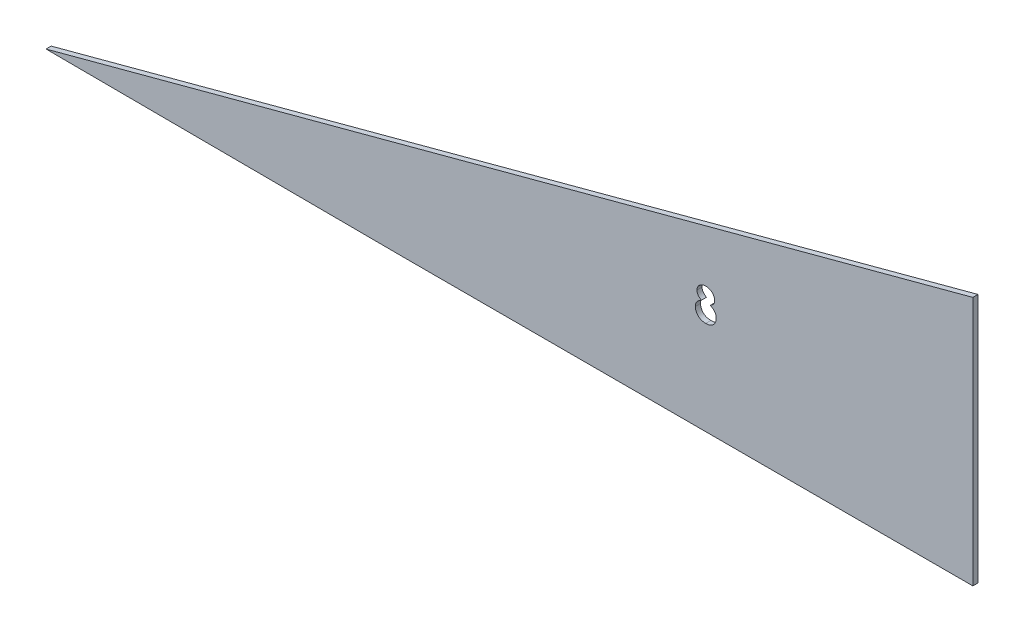
ISO-10303-21;
HEADER;
FILE_DESCRIPTION(('STEP AP214'),'2;1');
FILE_NAME('part.step','',(''),(''),'','','');
FILE_SCHEMA(('AUTOMOTIVE_DESIGN { 1 0 10303 214 1 1 1 1 }'));
ENDSEC;
DATA;
#1=APPLICATION_CONTEXT('core data for automotive mechanical design processes');
#2=APPLICATION_PROTOCOL_DEFINITION('international standard','automotive_design',2000,#1);
#3=PRODUCT_CONTEXT('',#1,'mechanical');
#4=PRODUCT('Part','Part','',(#3));
#5=PRODUCT_RELATED_PRODUCT_CATEGORY('part','',(#4));
#6=PRODUCT_DEFINITION_FORMATION('','',#4);
#7=PRODUCT_DEFINITION_CONTEXT('part definition',#1,'design');
#8=PRODUCT_DEFINITION('design','',#6,#7);
#9=PRODUCT_DEFINITION_SHAPE('','',#8);
#10=(LENGTH_UNIT() NAMED_UNIT(*) SI_UNIT(.MILLI.,.METRE.));
#11=(NAMED_UNIT(*) PLANE_ANGLE_UNIT() SI_UNIT($,.RADIAN.));
#12=(NAMED_UNIT(*) SI_UNIT($,.STERADIAN.) SOLID_ANGLE_UNIT());
#13=UNCERTAINTY_MEASURE_WITH_UNIT(LENGTH_MEASURE(1.E-05),#10,'distance_accuracy_value','');
#14=(GEOMETRIC_REPRESENTATION_CONTEXT(3) GLOBAL_UNCERTAINTY_ASSIGNED_CONTEXT((#13)) GLOBAL_UNIT_ASSIGNED_CONTEXT((#10,
#11,#12)) REPRESENTATION_CONTEXT('',''));
#15=CARTESIAN_POINT('',(0.,0.,0.));
#16=DIRECTION('',(0.,0.,1.));
#17=DIRECTION('',(1.,0.,0.));
#18=AXIS2_PLACEMENT_3D('',#15,#16,#17);
#19=CARTESIAN_POINT('',(0.,0.,-2105.025));
#20=DIRECTION('',(0.,0.,-1.));
#21=DIRECTION('',(1.,0.,0.));
#22=AXIS2_PLACEMENT_3D('',#19,#20,#21);
#23=PLANE('',#22);
#24=CARTESIAN_POINT('',(-108.484035099965,272.503264575399,-2105.025));
#25=CARTESIAN_POINT('',(-108.241807192656,272.495392336472,-2105.025));
#26=CARTESIAN_POINT('',(-107.764161354784,272.479869178137,-2105.025));
#27=CARTESIAN_POINT('',(-107.062062024677,272.350400598971,-2105.025));
#28=CARTESIAN_POINT('',(-106.390278048918,272.134158498639,-2105.025));
#29=CARTESIAN_POINT('',(-105.751126061882,271.840803611661,-2105.025));
#30=CARTESIAN_POINT('',(-105.156048326082,271.479468976697,-2105.025));
#31=CARTESIAN_POINT('',(-104.630255757144,271.041858504966,-2105.025));
#32=CARTESIAN_POINT('',(-104.165802703875,270.551230921757,-2105.025));
#33=CARTESIAN_POINT('',(-103.781621929411,270.001939938007,-2105.025));
#34=CARTESIAN_POINT('',(-103.465049631291,269.421273112649,-2105.025));
#35=CARTESIAN_POINT('',(-103.244609012356,268.813727677503,-2105.025));
#36=CARTESIAN_POINT('',(-103.103356125449,268.192430657128,-2105.025));
#37=CARTESIAN_POINT('',(-103.085539671892,267.772035235866,-2105.025));
#38=CARTESIAN_POINT('',(-103.076613224965,267.561407604245,-2105.025));
#39=B_SPLINE_CURVE_WITH_KNOTS('',3,(#24,#25,#26,#27,#28,#29,#30,#31,#32,#33,#34,#35,#36,#37,
#38),.UNSPECIFIED.,.F.,.F.,(4,1,1,1,1,1,1,1,1,1,1,1,4),(0.,0.0894097111101345,0.176305764483106,
0.262625902183418,0.349445726475656,0.435498263742955,0.518928130103714,0.601354656578741,
0.684256421718418,0.765806739796834,0.844876865710391,0.922279794848877,1.),.UNSPECIFIED.);
#40=CARTESIAN_POINT('',(-108.484035099965,272.503264575399,-2105.025));
#41=VERTEX_POINT('',#40);
#42=CARTESIAN_POINT('',(-103.076613224965,267.561407604245,-2105.025));
#43=VERTEX_POINT('',#42);
#44=EDGE_CURVE('E178',#41,#43,#39,.T.);
#45=ORIENTED_EDGE('',*,*,#44,.F.);
#46=CARTESIAN_POINT('',(-114.066997840349,267.614833085014,-2105.025));
#47=CARTESIAN_POINT('',(-114.058096460617,267.817838367063,-2105.025));
#48=CARTESIAN_POINT('',(-114.040203134988,268.225914387328,-2105.025));
#49=CARTESIAN_POINT('',(-113.89551391866,268.83337057283,-2105.025));
#50=CARTESIAN_POINT('',(-113.65972898521,269.429997876748,-2105.025));
#51=CARTESIAN_POINT('',(-113.339030415753,270.012904542242,-2105.025));
#52=CARTESIAN_POINT('',(-112.939594282156,270.562362139189,-2105.025));
#53=CARTESIAN_POINT('',(-112.460369511276,271.055163575398,-2105.025));
#54=CARTESIAN_POINT('',(-111.912800138581,271.486844644352,-2105.025));
#55=CARTESIAN_POINT('',(-111.299619462462,271.84920924174,-2105.025));
#56=CARTESIAN_POINT('',(-110.639747950826,272.144123155998,-2105.025));
#57=CARTESIAN_POINT('',(-109.943520939403,272.347568571625,-2105.025));
#58=CARTESIAN_POINT('',(-109.223069026641,272.48057086399,-2105.025));
#59=CARTESIAN_POINT('',(-108.73268001133,272.495629369953,-2105.025));
#60=CARTESIAN_POINT('',(-108.484035099965,272.503264575399,-2105.025));
#61=B_SPLINE_CURVE_WITH_KNOTS('',3,(#46,#47,#48,#49,#50,#51,#52,#53,#54,#55,#56,#57,#58,#59,
#60),.UNSPECIFIED.,.F.,.F.,(4,1,1,1,1,1,1,1,1,1,1,1,4),(0.,0.0740584262733843,0.148870352316877,
0.226667668369178,0.307734759451111,0.391157203805982,0.473929355542552,0.557927751515056,
0.644989290051361,0.733364055517616,0.82109204218416,0.909287214997338,1.),.UNSPECIFIED.);
#62=CARTESIAN_POINT('',(-114.066997840349,267.614833085014,-2105.025));
#63=VERTEX_POINT('',#62);
#64=EDGE_CURVE('E185',#63,#41,#61,.T.);
#65=ORIENTED_EDGE('',*,*,#64,.F.);
#66=CARTESIAN_POINT('',(-111.28505673458,263.577393181168,-2105.025));
#67=CARTESIAN_POINT('',(-111.505989788154,263.697869564655,-2105.025));
#68=CARTESIAN_POINT('',(-111.933778018924,263.931145564367,-2105.025));
#69=CARTESIAN_POINT('',(-112.500213119945,264.359753180388,-2105.025));
#70=CARTESIAN_POINT('',(-112.986753513318,264.823962572454,-2105.025));
#71=CARTESIAN_POINT('',(-113.380025619195,265.333576169993,-2105.025));
#72=CARTESIAN_POINT('',(-113.689573031988,265.872674157276,-2105.025));
#73=CARTESIAN_POINT('',(-113.90194572245,266.437883588083,-2105.025));
#74=CARTESIAN_POINT('',(-114.045618013958,267.018724148734,-2105.025));
#75=CARTESIAN_POINT('',(-114.05985014454,267.415542161536,-2105.025));
#76=CARTESIAN_POINT('',(-114.066997840349,267.614833085014,-2105.025));
#77=B_SPLINE_CURVE_WITH_KNOTS('',3,(#66,#67,#68,#69,#70,#71,#72,#73,#74,#75,#76),.UNSPECIFIED.,
.F.,.F.,(4,1,1,1,1,1,1,1,4),(0.,0.145860060391663,0.282425903075821,0.410850400357554,
0.535029421347933,0.654701078125942,0.7701334325965,0.884555844198861,1.),.UNSPECIFIED.);
#78=CARTESIAN_POINT('',(-111.28505673458,263.577393181168,-2105.025));
#79=VERTEX_POINT('',#78);
#80=EDGE_CURVE('E342',#79,#63,#77,.T.);
#81=ORIENTED_EDGE('',*,*,#80,.F.);
#82=CARTESIAN_POINT('',(-115.043920917272,258.35696048886,-2105.025));
#83=CARTESIAN_POINT('',(-115.040775593387,258.49063266266,-2105.025));
#84=CARTESIAN_POINT('',(-115.034559323216,258.754816059041,-2105.025));
#85=CARTESIAN_POINT('',(-114.991534363559,259.145119688708,-2105.025));
#86=CARTESIAN_POINT('',(-114.922364024179,259.525010079408,-2105.025));
#87=CARTESIAN_POINT('',(-114.828423266489,259.895890412852,-2105.025));
#88=CARTESIAN_POINT('',(-114.701109250997,260.255060596143,-2105.025));
#89=CARTESIAN_POINT('',(-114.547391354882,260.604222460027,-2105.025));
#90=CARTESIAN_POINT('',(-114.368147442114,260.943770198566,-2105.025));
#91=CARTESIAN_POINT('',(-114.160877100903,261.275560679812,-2105.025));
#92=CARTESIAN_POINT('',(-113.919747513124,261.594944882089,-2105.025));
#93=CARTESIAN_POINT('',(-113.64671393357,261.907343081322,-2105.025));
#94=CARTESIAN_POINT('',(-113.336319391264,262.207907815312,-2105.025));
#95=CARTESIAN_POINT('',(-112.992016990677,262.500311299501,-2105.025));
#96=CARTESIAN_POINT('',(-112.617741425872,262.789740528434,-2105.025));
#97=CARTESIAN_POINT('',(-112.203771152802,263.060553851304,-2105.025));
#98=CARTESIAN_POINT('',(-111.761080352398,263.331923630942,-2105.025));
#99=CARTESIAN_POINT('',(-111.446453787593,263.494166087957,-2105.025));
#100=CARTESIAN_POINT('',(-111.28505673458,263.577393181168,-2105.025));
#101=B_SPLINE_CURVE_WITH_KNOTS('',3,(#82,#83,#84,#85,#86,#87,#88,#89,#90,#91,#92,#93,#94,#95,
#96,#97,#98,#99,#100),.UNSPECIFIED.,.F.,.F.,(4,1,1,1,1,1,1,1,1,1,1,1,1,1,1,1,4),(0.,
0.0588535860286685,0.11631545896335,0.17267484341146,0.228780386880904,0.284580359125279,
0.340256506384547,0.396629805012459,0.453507262875195,0.512318189779994,0.572648444056831,
0.636021935821799,0.702362946389193,0.771483056056928,0.844184477489902,0.920069793972155,1.),.UNSPECIFIED.);
#102=CARTESIAN_POINT('',(-115.043920917272,258.35696048886,-2105.025));
#103=VERTEX_POINT('',#102);
#104=EDGE_CURVE('E344',#103,#79,#101,.T.);
#105=ORIENTED_EDGE('',*,*,#104,.F.);
#106=CARTESIAN_POINT('',(-108.598518273042,252.476341498475,-2105.025));
#107=CARTESIAN_POINT('',(-108.85440543108,252.482614271343,-2105.025));
#108=CARTESIAN_POINT('',(-109.352335849562,252.494820450202,-2105.025));
#109=CARTESIAN_POINT('',(-110.077095154462,252.577521570645,-2105.025));
#110=CARTESIAN_POINT('',(-110.752679291763,252.722453244994,-2105.025));
#111=CARTESIAN_POINT('',(-111.383016404931,252.920816047161,-2105.025));
#112=CARTESIAN_POINT('',(-111.964306435821,253.178863146996,-2105.025));
#113=CARTESIAN_POINT('',(-112.494893029348,253.500037486036,-2105.025));
#114=CARTESIAN_POINT('',(-112.982431364044,253.87141147837,-2105.025));
#115=CARTESIAN_POINT('',(-113.412125741597,254.30365096115,-2105.025));
#116=CARTESIAN_POINT('',(-113.793607128872,254.766608809077,-2105.025));
#117=CARTESIAN_POINT('',(-114.128713246283,255.244228285061,-2105.025));
#118=CARTESIAN_POINT('',(-114.407246445127,255.736552988238,-2105.025));
#119=CARTESIAN_POINT('',(-114.643069635507,256.236241929635,-2105.025));
#120=CARTESIAN_POINT('',(-114.823598444686,256.750298854263,-2105.025));
#121=CARTESIAN_POINT('',(-114.948632903759,257.276078925747,-2105.025));
#122=CARTESIAN_POINT('',(-115.02804045591,257.812663774699,-2105.025));
#123=CARTESIAN_POINT('',(-115.038605775879,258.174786058947,-2105.025));
#124=CARTESIAN_POINT('',(-115.043920917272,258.35696048886,-2105.025));
#125=B_SPLINE_CURVE_WITH_KNOTS('',3,(#106,#107,#108,#109,#110,#111,#112,#113,#114,#115,#116,
#117,#118,#119,#120,#121,#122,#123,#124),.UNSPECIFIED.,.F.,.F.,(4,1,1,1,1,1,1,1,1,1,1,1,1,1,1,1,
4),(0.,0.0785564333527024,0.152862840142093,0.223559693438289,0.29037494397821,
0.355403072822205,0.418291157044094,0.480388563775648,0.543072615206278,0.604923944462097,
0.664398309113301,0.721942554736705,0.778374891054674,0.833829940650944,0.888861236318888,
0.94408893957789,1.),.UNSPECIFIED.);
#126=CARTESIAN_POINT('',(-108.598518273041,252.476341498475,-2105.025));
#127=VERTEX_POINT('',#126);
#128=EDGE_CURVE('E348',#127,#103,#125,.T.);
#129=ORIENTED_EDGE('',*,*,#128,.F.);
#130=CARTESIAN_POINT('',(-103.542178128811,254.567567460014,-2105.025));
#131=CARTESIAN_POINT('',(-103.69368808181,254.401049917632,-2105.025));
#132=CARTESIAN_POINT('',(-103.994835737299,254.070072536321,-2105.025));
#133=CARTESIAN_POINT('',(-104.510725671896,253.640354556228,-2105.025));
#134=CARTESIAN_POINT('',(-105.076901925237,253.279224282664,-2105.025));
#135=CARTESIAN_POINT('',(-105.691173707171,252.984918685191,-2105.025));
#136=CARTESIAN_POINT('',(-106.35189901625,252.755851367328,-2105.025));
#137=CARTESIAN_POINT('',(-107.058937069915,252.591245662686,-2105.025));
#138=CARTESIAN_POINT('',(-107.813666245086,252.496962155092,-2105.025));
#139=CARTESIAN_POINT('',(-108.332400309301,252.483333296871,-2105.025));
#140=CARTESIAN_POINT('',(-108.598518273041,252.476341498475,-2105.025));
#141=B_SPLINE_CURVE_WITH_KNOTS('',3,(#130,#131,#132,#133,#134,#135,#136,#137,#138,#139,#140),
.UNSPECIFIED.,.F.,.F.,(4,1,1,1,1,1,1,1,4),(0.,0.119283450373374,0.237092882068634,
0.35479604421513,0.474576300940853,0.597460065814977,0.724926154615615,0.858883199192766,1.),.UNSPECIFIED.);
#142=CARTESIAN_POINT('',(-103.542178128811,254.567567460014,-2105.025));
#143=VERTEX_POINT('',#142);
#144=EDGE_CURVE('E378',#143,#127,#141,.T.);
#145=ORIENTED_EDGE('',*,*,#144,.F.);
#146=CARTESIAN_POINT('',(-102.099690148042,258.513420825398,-2105.025));
#147=CARTESIAN_POINT('',(-102.103888879835,258.330008880678,-2105.025));
#148=CARTESIAN_POINT('',(-102.112199745486,257.966967822991,-2105.025));
#149=CARTESIAN_POINT('',(-102.184589658533,257.43113970184,-2105.025));
#150=CARTESIAN_POINT('',(-102.292973155712,256.91073843163,-2105.025));
#151=CARTESIAN_POINT('',(-102.451248786829,256.40587810305,-2105.025));
#152=CARTESIAN_POINT('',(-102.656517385596,255.91934451386,-2105.025));
#153=CARTESIAN_POINT('',(-102.909484164286,255.450721189835,-2105.025));
#154=CARTESIAN_POINT('',(-103.195839438013,254.992327521331,-2105.025));
#155=CARTESIAN_POINT('',(-103.425812339978,254.71028192107,-2105.025));
#156=CARTESIAN_POINT('',(-103.542178128811,254.567567460014,-2105.025));
#157=B_SPLINE_CURVE_WITH_KNOTS('',3,(#146,#147,#148,#149,#150,#151,#152,#153,#154,#155,#156),
.UNSPECIFIED.,.F.,.F.,(4,1,1,1,1,1,1,1,4),(0.,0.128158185527675,0.253673136153171,
0.377325305973494,0.499384554764616,0.622918368042345,0.745839393104584,0.871395285014032,1.),.UNSPECIFIED.);
#158=CARTESIAN_POINT('',(-102.099690148042,258.513420825398,-2105.025));
#159=VERTEX_POINT('',#158);
#160=EDGE_CURVE('E387',#159,#143,#157,.T.);
#161=ORIENTED_EDGE('',*,*,#160,.F.);
#162=CARTESIAN_POINT('',(-105.782232215349,263.577393181168,-2105.025));
#163=CARTESIAN_POINT('',(-105.626302265862,263.496088020879,-2105.025));
#164=CARTESIAN_POINT('',(-105.322186788924,263.337515805085,-2105.025));
#165=CARTESIAN_POINT('',(-104.889059412808,263.082186871524,-2105.025));
#166=CARTESIAN_POINT('',(-104.493227620286,262.81308676275,-2105.025));
#167=CARTESIAN_POINT('',(-104.123708991126,262.542925870805,-2105.025));
#168=CARTESIAN_POINT('',(-103.786995610307,262.261357882477,-2105.025));
#169=CARTESIAN_POINT('',(-103.486852448887,261.967263132259,-2105.025));
#170=CARTESIAN_POINT('',(-103.215865546191,261.667982487156,-2105.025));
#171=CARTESIAN_POINT('',(-102.979499764763,261.358448071402,-2105.025));
#172=CARTESIAN_POINT('',(-102.771599839192,261.03948222419,-2105.025));
#173=CARTESIAN_POINT('',(-102.591919503298,260.710247752345,-2105.025));
#174=CARTESIAN_POINT('',(-102.438337299309,260.371466178536,-2105.025));
#175=CARTESIAN_POINT('',(-102.316619018523,260.019439432744,-2105.025));
#176=CARTESIAN_POINT('',(-102.216351838035,259.659338580005,-2105.025));
#177=CARTESIAN_POINT('',(-102.147360330593,259.286513850209,-2105.025));
#178=CARTESIAN_POINT('',(-102.110256820757,258.903421937621,-2105.025));
#179=CARTESIAN_POINT('',(-102.103241993313,258.644514467027,-2105.025));
#180=CARTESIAN_POINT('',(-102.099690148042,258.513420825398,-2105.025));
#181=B_SPLINE_CURVE_WITH_KNOTS('',3,(#162,#163,#164,#165,#166,#167,#168,#169,#170,#171,#172,
#173,#174,#175,#176,#177,#178,#179,#180),.UNSPECIFIED.,.F.,.F.,(4,1,1,1,1,1,1,1,1,1,1,1,1,1,1,1,
4),(0.,0.0795248295850149,0.155099976349537,0.227219820073269,0.295910504191472,
0.362055880947179,0.425520116912639,0.485812719225311,0.544494706001814,0.601459635722228,
0.657840593796651,0.713974472193142,0.769467951597453,0.826129967181328,0.882885359309069,
0.940700881666205,1.),.UNSPECIFIED.);
#182=CARTESIAN_POINT('',(-105.782232215349,263.577393181168,-2105.025));
#183=VERTEX_POINT('',#182);
#184=EDGE_CURVE('E217',#183,#159,#181,.T.);
#185=ORIENTED_EDGE('',*,*,#184,.F.);
#186=CARTESIAN_POINT('',(-103.076613224965,267.561407604245,-2105.025));
#187=CARTESIAN_POINT('',(-103.08442133355,267.35470604811,-2105.025));
#188=CARTESIAN_POINT('',(-103.099756015022,266.948755940169,-2105.025));
#189=CARTESIAN_POINT('',(-103.228751400163,266.356973021567,-2105.025));
#190=CARTESIAN_POINT('',(-103.445993864191,265.80277020967,-2105.025));
#191=CARTESIAN_POINT('',(-103.742597808428,265.279858855716,-2105.025));
#192=CARTESIAN_POINT('',(-104.129179390316,264.797722418726,-2105.025));
#193=CARTESIAN_POINT('',(-104.600578351613,264.350229918317,-2105.025));
#194=CARTESIAN_POINT('',(-105.153036397546,263.933705324106,-2105.025));
#195=CARTESIAN_POINT('',(-105.568113506794,263.698648112828,-2105.025));
#196=CARTESIAN_POINT('',(-105.782232215349,263.577393181168,-2105.025));
#197=B_SPLINE_CURVE_WITH_KNOTS('',3,(#186,#187,#188,#189,#190,#191,#192,#193,#194,#195,#196),
.UNSPECIFIED.,.F.,.F.,(4,1,1,1,1,1,1,1,4),(0.,0.121904040869889,0.239412607602006,
0.355410104280179,0.472090728803307,0.59285898215636,0.718703467713687,0.85489238295153,1.),.UNSPECIFIED.);
#198=EDGE_CURVE('E209',#43,#183,#197,.T.);
#199=ORIENTED_EDGE('',*,*,#198,.F.);
#200=EDGE_LOOP('',(#45,#65,#81,#105,#129,#145,#161,#185,#199));
#201=FACE_BOUND('',#200,.T.);
#202=DIRECTION('',(-0.965925826289067,-0.258819045102525,0.));
#203=VECTOR('',#202,1.);
#204=CARTESIAN_POINT('',(-528.828383705815,192.223910105501,-2105.025));
#205=LINE('',#204,#203);
#206=CARTESIAN_POINT('',(56.8249999999999,349.149261314031,-2105.025));
#207=VERTEX_POINT('',#206);
#208=CARTESIAN_POINT('',(-517.166840410992,195.348611213849,-2105.025));
#209=VERTEX_POINT('',#208);
#210=EDGE_CURVE('E158',#207,#209,#205,.T.);
#211=ORIENTED_EDGE('',*,*,#210,.F.);
#212=DIRECTION('',(0.,1.,0.));
#213=VECTOR('',#212,1.);
#214=CARTESIAN_POINT('',(56.8249999999999,350.,-2105.025));
#215=LINE('',#214,#213);
#216=CARTESIAN_POINT('',(56.8249999999999,194.391,-2105.025));
#217=VERTEX_POINT('',#216);
#218=EDGE_CURVE('E147',#217,#207,#215,.T.);
#219=ORIENTED_EDGE('',*,*,#218,.F.);
#220=DIRECTION('',(1.,0.,0.));
#221=VECTOR('',#220,1.);
#222=CARTESIAN_POINT('',(-295.286818264098,194.391,-2105.025));
#223=LINE('',#222,#221);
#224=CARTESIAN_POINT('',(-295.279967021823,194.391,-2105.025));
#225=VERTEX_POINT('',#224);
#226=EDGE_CURVE('E157',#225,#217,#223,.T.);
#227=ORIENTED_EDGE('',*,*,#226,.F.);
#228=DIRECTION('',(0.999990687223878,-0.00431572305834903,0.));
#229=VECTOR('',#228,1.);
#230=CARTESIAN_POINT('',(-528.814681285105,195.398880537437,-2105.025));
#231=LINE('',#230,#229);
#232=EDGE_CURVE('E74',#209,#225,#231,.T.);
#233=ORIENTED_EDGE('',*,*,#232,.F.);
#234=EDGE_LOOP('',(#211,#219,#227,#233));
#235=FACE_BOUND('',#234,.T.);
#236=ADVANCED_FACE('F49',(#201,#235),#23,.T.);
#237=CARTESIAN_POINT('',(0.,0.,-2101.85));
#238=DIRECTION('',(0.,0.,-1.));
#239=DIRECTION('',(1.,0.,0.));
#240=AXIS2_PLACEMENT_3D('',#237,#238,#239);
#241=PLANE('',#240);
#242=CARTESIAN_POINT('',(-108.484035099965,272.503264575399,-2101.85));
#243=CARTESIAN_POINT('',(-108.241807192656,272.495392336472,-2101.85));
#244=CARTESIAN_POINT('',(-107.764161354784,272.479869178137,-2101.85));
#245=CARTESIAN_POINT('',(-107.062062024677,272.350400598971,-2101.85));
#246=CARTESIAN_POINT('',(-106.390278048918,272.134158498639,-2101.85));
#247=CARTESIAN_POINT('',(-105.751126061882,271.840803611661,-2101.85));
#248=CARTESIAN_POINT('',(-105.156048326082,271.479468976697,-2101.85));
#249=CARTESIAN_POINT('',(-104.630255757144,271.041858504966,-2101.85));
#250=CARTESIAN_POINT('',(-104.165802703875,270.551230921757,-2101.85));
#251=CARTESIAN_POINT('',(-103.781621929411,270.001939938007,-2101.85));
#252=CARTESIAN_POINT('',(-103.465049631291,269.421273112649,-2101.85));
#253=CARTESIAN_POINT('',(-103.244609012356,268.813727677503,-2101.85));
#254=CARTESIAN_POINT('',(-103.103356125449,268.192430657128,-2101.85));
#255=CARTESIAN_POINT('',(-103.085539671892,267.772035235866,-2101.85));
#256=CARTESIAN_POINT('',(-103.076613224965,267.561407604245,-2101.85));
#257=B_SPLINE_CURVE_WITH_KNOTS('',3,(#242,#243,#244,#245,#246,#247,#248,#249,#250,#251,#252,
#253,#254,#255,#256),.UNSPECIFIED.,.F.,.F.,(4,1,1,1,1,1,1,1,1,1,1,1,4),(0.,0.0894097111101345,
0.176305764483106,0.262625902183418,0.349445726475656,0.435498263742955,0.518928130103714,
0.601354656578741,0.684256421718418,0.765806739796834,0.844876865710391,0.922279794848877,1.),.UNSPECIFIED.);
#258=CARTESIAN_POINT('',(-108.484035099965,272.503264575399,-2101.85));
#259=VERTEX_POINT('',#258);
#260=CARTESIAN_POINT('',(-103.076613224965,267.561407604245,-2101.85));
#261=VERTEX_POINT('',#260);
#262=EDGE_CURVE('E227',#259,#261,#257,.T.);
#263=ORIENTED_EDGE('',*,*,#262,.T.);
#264=CARTESIAN_POINT('',(-103.076613224965,267.561407604245,-2101.85));
#265=CARTESIAN_POINT('',(-103.08442133355,267.35470604811,-2101.85));
#266=CARTESIAN_POINT('',(-103.099756015022,266.948755940169,-2101.85));
#267=CARTESIAN_POINT('',(-103.228751400163,266.356973021567,-2101.85));
#268=CARTESIAN_POINT('',(-103.445993864191,265.80277020967,-2101.85));
#269=CARTESIAN_POINT('',(-103.742597808428,265.279858855716,-2101.85));
#270=CARTESIAN_POINT('',(-104.129179390316,264.797722418726,-2101.85));
#271=CARTESIAN_POINT('',(-104.600578351613,264.350229918317,-2101.85));
#272=CARTESIAN_POINT('',(-105.153036397546,263.933705324106,-2101.85));
#273=CARTESIAN_POINT('',(-105.568113506794,263.698648112828,-2101.85));
#274=CARTESIAN_POINT('',(-105.782232215349,263.577393181168,-2101.85));
#275=B_SPLINE_CURVE_WITH_KNOTS('',3,(#264,#265,#266,#267,#268,#269,#270,#271,#272,#273,#274),
.UNSPECIFIED.,.F.,.F.,(4,1,1,1,1,1,1,1,4),(0.,0.121904040869889,0.239412607602006,
0.355410104280179,0.472090728803307,0.59285898215636,0.718703467713687,0.85489238295153,1.),.UNSPECIFIED.);
#276=CARTESIAN_POINT('',(-105.782232215349,263.577393181168,-2101.85));
#277=VERTEX_POINT('',#276);
#278=EDGE_CURVE('E179',#261,#277,#275,.T.);
#279=ORIENTED_EDGE('',*,*,#278,.T.);
#280=CARTESIAN_POINT('',(-105.782232215349,263.577393181168,-2101.85));
#281=CARTESIAN_POINT('',(-105.626302265862,263.496088020879,-2101.85));
#282=CARTESIAN_POINT('',(-105.322186788924,263.337515805085,-2101.85));
#283=CARTESIAN_POINT('',(-104.889059412808,263.082186871524,-2101.85));
#284=CARTESIAN_POINT('',(-104.493227620286,262.81308676275,-2101.85));
#285=CARTESIAN_POINT('',(-104.123708991126,262.542925870805,-2101.85));
#286=CARTESIAN_POINT('',(-103.786995610307,262.261357882477,-2101.85));
#287=CARTESIAN_POINT('',(-103.486852448887,261.967263132259,-2101.85));
#288=CARTESIAN_POINT('',(-103.215865546191,261.667982487156,-2101.85));
#289=CARTESIAN_POINT('',(-102.979499764763,261.358448071402,-2101.85));
#290=CARTESIAN_POINT('',(-102.771599839192,261.03948222419,-2101.85));
#291=CARTESIAN_POINT('',(-102.591919503298,260.710247752345,-2101.85));
#292=CARTESIAN_POINT('',(-102.438337299309,260.371466178536,-2101.85));
#293=CARTESIAN_POINT('',(-102.316619018523,260.019439432744,-2101.85));
#294=CARTESIAN_POINT('',(-102.216351838035,259.659338580005,-2101.85));
#295=CARTESIAN_POINT('',(-102.147360330593,259.286513850209,-2101.85));
#296=CARTESIAN_POINT('',(-102.110256820757,258.903421937621,-2101.85));
#297=CARTESIAN_POINT('',(-102.103241993313,258.644514467027,-2101.85));
#298=CARTESIAN_POINT('',(-102.099690148042,258.513420825398,-2101.85));
#299=B_SPLINE_CURVE_WITH_KNOTS('',3,(#280,#281,#282,#283,#284,#285,#286,#287,#288,#289,#290,
#291,#292,#293,#294,#295,#296,#297,#298),.UNSPECIFIED.,.F.,.F.,(4,1,1,1,1,1,1,1,1,1,1,1,1,1,1,1,
4),(0.,0.0795248295850149,0.155099976349537,0.227219820073269,0.295910504191472,
0.362055880947179,0.425520116912639,0.485812719225311,0.544494706001814,0.601459635722228,
0.657840593796651,0.713974472193142,0.769467951597453,0.826129967181328,0.882885359309069,
0.940700881666205,1.),.UNSPECIFIED.);
#300=CARTESIAN_POINT('',(-102.099690148042,258.513420825398,-2101.85));
#301=VERTEX_POINT('',#300);
#302=EDGE_CURVE('E242',#277,#301,#299,.T.);
#303=ORIENTED_EDGE('',*,*,#302,.T.);
#304=CARTESIAN_POINT('',(-102.099690148042,258.513420825398,-2101.85));
#305=CARTESIAN_POINT('',(-102.103888879835,258.330008880678,-2101.85));
#306=CARTESIAN_POINT('',(-102.112199745486,257.966967822991,-2101.85));
#307=CARTESIAN_POINT('',(-102.184589658533,257.43113970184,-2101.85));
#308=CARTESIAN_POINT('',(-102.292973155712,256.91073843163,-2101.85));
#309=CARTESIAN_POINT('',(-102.451248786829,256.40587810305,-2101.85));
#310=CARTESIAN_POINT('',(-102.656517385596,255.91934451386,-2101.85));
#311=CARTESIAN_POINT('',(-102.909484164286,255.450721189835,-2101.85));
#312=CARTESIAN_POINT('',(-103.195839438013,254.992327521331,-2101.85));
#313=CARTESIAN_POINT('',(-103.425812339978,254.71028192107,-2101.85));
#314=CARTESIAN_POINT('',(-103.542178128811,254.567567460014,-2101.85));
#315=B_SPLINE_CURVE_WITH_KNOTS('',3,(#304,#305,#306,#307,#308,#309,#310,#311,#312,#313,#314),
.UNSPECIFIED.,.F.,.F.,(4,1,1,1,1,1,1,1,4),(0.,0.128158185527675,0.253673136153171,
0.377325305973494,0.499384554764616,0.622918368042345,0.745839393104584,0.871395285014032,1.),.UNSPECIFIED.);
#316=CARTESIAN_POINT('',(-103.542178128811,254.567567460014,-2101.85));
#317=VERTEX_POINT('',#316);
#318=EDGE_CURVE('E251',#301,#317,#315,.T.);
#319=ORIENTED_EDGE('',*,*,#318,.T.);
#320=CARTESIAN_POINT('',(-103.542178128811,254.567567460014,-2101.85));
#321=CARTESIAN_POINT('',(-103.69368808181,254.401049917632,-2101.85));
#322=CARTESIAN_POINT('',(-103.994835737299,254.070072536321,-2101.85));
#323=CARTESIAN_POINT('',(-104.510725671896,253.640354556228,-2101.85));
#324=CARTESIAN_POINT('',(-105.076901925237,253.279224282664,-2101.85));
#325=CARTESIAN_POINT('',(-105.691173707171,252.984918685191,-2101.85));
#326=CARTESIAN_POINT('',(-106.35189901625,252.755851367328,-2101.85));
#327=CARTESIAN_POINT('',(-107.058937069915,252.591245662686,-2101.85));
#328=CARTESIAN_POINT('',(-107.813666245086,252.496962155092,-2101.85));
#329=CARTESIAN_POINT('',(-108.332400309301,252.483333296871,-2101.85));
#330=CARTESIAN_POINT('',(-108.598518273041,252.476341498475,-2101.85));
#331=B_SPLINE_CURVE_WITH_KNOTS('',3,(#320,#321,#322,#323,#324,#325,#326,#327,#328,#329,#330),
.UNSPECIFIED.,.F.,.F.,(4,1,1,1,1,1,1,1,4),(0.,0.119283450373374,0.237092882068634,
0.35479604421513,0.474576300940853,0.597460065814977,0.724926154615615,0.858883199192766,1.),.UNSPECIFIED.);
#332=CARTESIAN_POINT('',(-108.598518273041,252.476341498475,-2101.85));
#333=VERTEX_POINT('',#332);
#334=EDGE_CURVE('E260',#317,#333,#331,.T.);
#335=ORIENTED_EDGE('',*,*,#334,.T.);
#336=CARTESIAN_POINT('',(-108.598518273042,252.476341498475,-2101.85));
#337=CARTESIAN_POINT('',(-108.85440543108,252.482614271343,-2101.85));
#338=CARTESIAN_POINT('',(-109.352335849562,252.494820450202,-2101.85));
#339=CARTESIAN_POINT('',(-110.077095154462,252.577521570645,-2101.85));
#340=CARTESIAN_POINT('',(-110.752679291763,252.722453244994,-2101.85));
#341=CARTESIAN_POINT('',(-111.383016404931,252.920816047161,-2101.85));
#342=CARTESIAN_POINT('',(-111.964306435821,253.178863146996,-2101.85));
#343=CARTESIAN_POINT('',(-112.494893029348,253.500037486036,-2101.85));
#344=CARTESIAN_POINT('',(-112.982431364044,253.87141147837,-2101.85));
#345=CARTESIAN_POINT('',(-113.412125741597,254.30365096115,-2101.85));
#346=CARTESIAN_POINT('',(-113.793607128872,254.766608809077,-2101.85));
#347=CARTESIAN_POINT('',(-114.128713246283,255.244228285061,-2101.85));
#348=CARTESIAN_POINT('',(-114.407246445127,255.736552988238,-2101.85));
#349=CARTESIAN_POINT('',(-114.643069635507,256.236241929635,-2101.85));
#350=CARTESIAN_POINT('',(-114.823598444686,256.750298854263,-2101.85));
#351=CARTESIAN_POINT('',(-114.948632903759,257.276078925747,-2101.85));
#352=CARTESIAN_POINT('',(-115.02804045591,257.812663774699,-2101.85));
#353=CARTESIAN_POINT('',(-115.038605775879,258.174786058947,-2101.85));
#354=CARTESIAN_POINT('',(-115.043920917272,258.35696048886,-2101.85));
#355=B_SPLINE_CURVE_WITH_KNOTS('',3,(#336,#337,#338,#339,#340,#341,#342,#343,#344,#345,#346,
#347,#348,#349,#350,#351,#352,#353,#354),.UNSPECIFIED.,.F.,.F.,(4,1,1,1,1,1,1,1,1,1,1,1,1,1,1,1,
4),(0.,0.0785564333527024,0.152862840142093,0.223559693438289,0.29037494397821,
0.355403072822205,0.418291157044094,0.480388563775648,0.543072615206278,0.604923944462097,
0.664398309113301,0.721942554736705,0.778374891054674,0.833829940650944,0.888861236318888,
0.94408893957789,1.),.UNSPECIFIED.);
#356=CARTESIAN_POINT('',(-115.043920917272,258.35696048886,-2101.85));
#357=VERTEX_POINT('',#356);
#358=EDGE_CURVE('E269',#333,#357,#355,.T.);
#359=ORIENTED_EDGE('',*,*,#358,.T.);
#360=CARTESIAN_POINT('',(-115.043920917272,258.35696048886,-2101.85));
#361=CARTESIAN_POINT('',(-115.040775593387,258.49063266266,-2101.85));
#362=CARTESIAN_POINT('',(-115.034559323216,258.754816059041,-2101.85));
#363=CARTESIAN_POINT('',(-114.991534363559,259.145119688708,-2101.85));
#364=CARTESIAN_POINT('',(-114.922364024179,259.525010079408,-2101.85));
#365=CARTESIAN_POINT('',(-114.828423266489,259.895890412852,-2101.85));
#366=CARTESIAN_POINT('',(-114.701109250997,260.255060596143,-2101.85));
#367=CARTESIAN_POINT('',(-114.547391354882,260.604222460027,-2101.85));
#368=CARTESIAN_POINT('',(-114.368147442114,260.943770198566,-2101.85));
#369=CARTESIAN_POINT('',(-114.160877100903,261.275560679812,-2101.85));
#370=CARTESIAN_POINT('',(-113.919747513124,261.594944882089,-2101.85));
#371=CARTESIAN_POINT('',(-113.64671393357,261.907343081322,-2101.85));
#372=CARTESIAN_POINT('',(-113.336319391264,262.207907815312,-2101.85));
#373=CARTESIAN_POINT('',(-112.992016990677,262.500311299501,-2101.85));
#374=CARTESIAN_POINT('',(-112.617741425872,262.789740528434,-2101.85));
#375=CARTESIAN_POINT('',(-112.203771152802,263.060553851304,-2101.85));
#376=CARTESIAN_POINT('',(-111.761080352398,263.331923630942,-2101.85));
#377=CARTESIAN_POINT('',(-111.446453787593,263.494166087957,-2101.85));
#378=CARTESIAN_POINT('',(-111.28505673458,263.577393181168,-2101.85));
#379=B_SPLINE_CURVE_WITH_KNOTS('',3,(#360,#361,#362,#363,#364,#365,#366,#367,#368,#369,#370,
#371,#372,#373,#374,#375,#376,#377,#378),.UNSPECIFIED.,.F.,.F.,(4,1,1,1,1,1,1,1,1,1,1,1,1,1,1,1,
4),(0.,0.0588535860286685,0.11631545896335,0.17267484341146,0.228780386880904,0.284580359125279,
0.340256506384547,0.396629805012459,0.453507262875195,0.512318189779994,0.572648444056831,
0.636021935821799,0.702362946389193,0.771483056056928,0.844184477489902,0.920069793972155,1.),.UNSPECIFIED.);
#380=CARTESIAN_POINT('',(-111.28505673458,263.577393181168,-2101.85));
#381=VERTEX_POINT('',#380);
#382=EDGE_CURVE('E278',#357,#381,#379,.T.);
#383=ORIENTED_EDGE('',*,*,#382,.T.);
#384=CARTESIAN_POINT('',(-111.28505673458,263.577393181168,-2101.85));
#385=CARTESIAN_POINT('',(-111.505989788154,263.697869564655,-2101.85));
#386=CARTESIAN_POINT('',(-111.933778018924,263.931145564367,-2101.85));
#387=CARTESIAN_POINT('',(-112.500213119945,264.359753180388,-2101.85));
#388=CARTESIAN_POINT('',(-112.986753513318,264.823962572454,-2101.85));
#389=CARTESIAN_POINT('',(-113.380025619195,265.333576169993,-2101.85));
#390=CARTESIAN_POINT('',(-113.689573031988,265.872674157276,-2101.85));
#391=CARTESIAN_POINT('',(-113.90194572245,266.437883588083,-2101.85));
#392=CARTESIAN_POINT('',(-114.045618013958,267.018724148734,-2101.85));
#393=CARTESIAN_POINT('',(-114.05985014454,267.415542161536,-2101.85));
#394=CARTESIAN_POINT('',(-114.066997840349,267.614833085014,-2101.85));
#395=B_SPLINE_CURVE_WITH_KNOTS('',3,(#384,#385,#386,#387,#388,#389,#390,#391,#392,#393,#394),
.UNSPECIFIED.,.F.,.F.,(4,1,1,1,1,1,1,1,4),(0.,0.145860060391663,0.282425903075821,
0.410850400357554,0.535029421347933,0.654701078125942,0.7701334325965,0.884555844198861,1.),.UNSPECIFIED.);
#396=CARTESIAN_POINT('',(-114.066997840349,267.614833085014,-2101.85));
#397=VERTEX_POINT('',#396);
#398=EDGE_CURVE('E287',#381,#397,#395,.T.);
#399=ORIENTED_EDGE('',*,*,#398,.T.);
#400=CARTESIAN_POINT('',(-114.066997840349,267.614833085014,-2101.85));
#401=CARTESIAN_POINT('',(-114.058096460617,267.817838367063,-2101.85));
#402=CARTESIAN_POINT('',(-114.040203134988,268.225914387328,-2101.85));
#403=CARTESIAN_POINT('',(-113.89551391866,268.83337057283,-2101.85));
#404=CARTESIAN_POINT('',(-113.65972898521,269.429997876748,-2101.85));
#405=CARTESIAN_POINT('',(-113.339030415753,270.012904542242,-2101.85));
#406=CARTESIAN_POINT('',(-112.939594282156,270.562362139189,-2101.85));
#407=CARTESIAN_POINT('',(-112.460369511276,271.055163575398,-2101.85));
#408=CARTESIAN_POINT('',(-111.912800138581,271.486844644352,-2101.85));
#409=CARTESIAN_POINT('',(-111.299619462462,271.84920924174,-2101.85));
#410=CARTESIAN_POINT('',(-110.639747950826,272.144123155998,-2101.85));
#411=CARTESIAN_POINT('',(-109.943520939403,272.347568571625,-2101.85));
#412=CARTESIAN_POINT('',(-109.223069026641,272.48057086399,-2101.85));
#413=CARTESIAN_POINT('',(-108.73268001133,272.495629369953,-2101.85));
#414=CARTESIAN_POINT('',(-108.484035099965,272.503264575399,-2101.85));
#415=B_SPLINE_CURVE_WITH_KNOTS('',3,(#400,#401,#402,#403,#404,#405,#406,#407,#408,#409,#410,
#411,#412,#413,#414),.UNSPECIFIED.,.F.,.F.,(4,1,1,1,1,1,1,1,1,1,1,1,4),(0.,0.0740584262733843,
0.148870352316877,0.226667668369178,0.307734759451111,0.391157203805982,0.473929355542552,
0.557927751515056,0.644989290051361,0.733364055517616,0.82109204218416,0.909287214997338,1.),.UNSPECIFIED.);
#416=EDGE_CURVE('E233',#397,#259,#415,.T.);
#417=ORIENTED_EDGE('',*,*,#416,.T.);
#418=EDGE_LOOP('',(#263,#279,#303,#319,#335,#359,#383,#399,#417));
#419=FACE_BOUND('',#418,.T.);
#420=DIRECTION('',(0.,-1.,0.));
#421=VECTOR('',#420,1.);
#422=CARTESIAN_POINT('',(56.8249999999999,350.,-2101.85));
#423=LINE('',#422,#421);
#424=CARTESIAN_POINT('',(56.8249999999999,349.149261314031,-2101.85));
#425=VERTEX_POINT('',#424);
#426=CARTESIAN_POINT('',(56.825,194.391,-2101.85));
#427=VERTEX_POINT('',#426);
#428=EDGE_CURVE('E66',#425,#427,#423,.T.);
#429=ORIENTED_EDGE('',*,*,#428,.F.);
#430=DIRECTION('',(-0.965925826289067,-0.258819045102525,0.));
#431=VECTOR('',#430,1.);
#432=CARTESIAN_POINT('',(-528.828383705815,192.223910105501,-2101.85));
#433=LINE('',#432,#431);
#434=CARTESIAN_POINT('',(-517.166840410992,195.348611213849,-2101.85));
#435=VERTEX_POINT('',#434);
#436=EDGE_CURVE('E169',#425,#435,#433,.T.);
#437=ORIENTED_EDGE('',*,*,#436,.T.);
#438=DIRECTION('',(-0.999990687223878,0.00431572305834903,0.));
#439=VECTOR('',#438,1.);
#440=CARTESIAN_POINT('',(-528.814681285105,195.398880537437,-2101.85));
#441=LINE('',#440,#439);
#442=CARTESIAN_POINT('',(-295.279967021823,194.391,-2101.85));
#443=VERTEX_POINT('',#442);
#444=EDGE_CURVE('E172',#443,#435,#441,.T.);
#445=ORIENTED_EDGE('',*,*,#444,.F.);
#446=DIRECTION('',(-1.,0.,0.));
#447=VECTOR('',#446,1.);
#448=CARTESIAN_POINT('',(-295.286818264098,194.391,-2101.85));
#449=LINE('',#448,#447);
#450=EDGE_CURVE('E164',#427,#443,#449,.T.);
#451=ORIENTED_EDGE('',*,*,#450,.F.);
#452=EDGE_LOOP('',(#429,#437,#445,#451));
#453=FACE_BOUND('',#452,.T.);
#454=ADVANCED_FACE('F409',(#419,#453),#241,.F.);
#455=CARTESIAN_POINT('',(-528.828383705815,192.223910105501,-2105.025));
#456=DIRECTION('',(0.258819045102525,-0.965925826289067,0.));
#457=DIRECTION('',(-0.965925826289067,-0.258819045102525,0.));
#458=AXIS2_PLACEMENT_3D('',#455,#456,#457);
#459=PLANE('',#458);
#460=ORIENTED_EDGE('',*,*,#436,.F.);
#461=DIRECTION('',(0.,0.,1.));
#462=VECTOR('',#461,1.);
#463=CARTESIAN_POINT('',(56.8249999999999,349.149261314031,-2105.025));
#464=LINE('',#463,#462);
#465=EDGE_CURVE('E160',#425,#207,#464,.F.);
#466=ORIENTED_EDGE('',*,*,#465,.T.);
#467=ORIENTED_EDGE('',*,*,#210,.T.);
#468=DIRECTION('',(0.,0.,-1.));
#469=VECTOR('',#468,1.);
#470=CARTESIAN_POINT('',(-517.166840410992,195.348611213849,-2105.025));
#471=LINE('',#470,#469);
#472=EDGE_CURVE('E165',#209,#435,#471,.F.);
#473=ORIENTED_EDGE('',*,*,#472,.T.);
#474=EDGE_LOOP('',(#460,#466,#467,#473));
#475=FACE_BOUND('',#474,.T.);
#476=ADVANCED_FACE('F200',(#475),#459,.F.);
#477=CARTESIAN_POINT('',(0.,194.391,0.));
#478=DIRECTION('',(0.,-1.,0.));
#479=DIRECTION('',(1.,0.,0.));
#480=AXIS2_PLACEMENT_3D('',#477,#478,#479);
#481=PLANE('',#480);
#482=ORIENTED_EDGE('',*,*,#226,.T.);
#483=DIRECTION('',(0.,0.,-1.));
#484=VECTOR('',#483,1.);
#485=CARTESIAN_POINT('',(56.8249999999999,194.391,-2101.85));
#486=LINE('',#485,#484);
#487=EDGE_CURVE('E144',#427,#217,#486,.T.);
#488=ORIENTED_EDGE('',*,*,#487,.F.);
#489=ORIENTED_EDGE('',*,*,#450,.T.);
#490=DIRECTION('',(0.,0.,-1.));
#491=VECTOR('',#490,1.);
#492=CARTESIAN_POINT('',(-295.279967021823,194.391,0.));
#493=LINE('',#492,#491);
#494=EDGE_CURVE('E11',#443,#225,#493,.T.);
#495=ORIENTED_EDGE('',*,*,#494,.T.);
#496=EDGE_LOOP('',(#482,#488,#489,#495));
#497=FACE_BOUND('',#496,.T.);
#498=ADVANCED_FACE('F162',(#497),#481,.T.);
#499=DIRECTION('',(0.,0.,-1.));
#500=VECTOR('',#499,1.);
#501=SURFACE_OF_LINEAR_EXTRUSION('',#77,#500);
#502=DIRECTION('',(0.,0.,-1.));
#503=VECTOR('',#502,1.);
#504=CARTESIAN_POINT('',(-114.066997840349,267.614833085014,-2105.025));
#505=LINE('',#504,#503);
#506=EDGE_CURVE('E59',#397,#63,#505,.T.);
#507=ORIENTED_EDGE('',*,*,#506,.F.);
#508=ORIENTED_EDGE('',*,*,#398,.F.);
#509=DIRECTION('',(0.,0.,-1.));
#510=VECTOR('',#509,1.);
#511=CARTESIAN_POINT('',(-111.28505673458,263.577393181168,-2105.025));
#512=LINE('',#511,#510);
#513=EDGE_CURVE('E325',#381,#79,#512,.T.);
#514=ORIENTED_EDGE('',*,*,#513,.T.);
#515=ORIENTED_EDGE('',*,*,#80,.T.);
#516=EDGE_LOOP('',(#507,#508,#514,#515));
#517=FACE_BOUND('',#516,.T.);
#518=ADVANCED_FACE('F360',(#517),#501,.F.);
#519=DIRECTION('',(0.,0.,-1.));
#520=VECTOR('',#519,1.);
#521=SURFACE_OF_LINEAR_EXTRUSION('',#101,#520);
#522=ORIENTED_EDGE('',*,*,#513,.F.);
#523=ORIENTED_EDGE('',*,*,#382,.F.);
#524=DIRECTION('',(0.,0.,-1.));
#525=VECTOR('',#524,1.);
#526=CARTESIAN_POINT('',(-115.043920917272,258.35696048886,-2105.025));
#527=LINE('',#526,#525);
#528=EDGE_CURVE('E322',#357,#103,#527,.T.);
#529=ORIENTED_EDGE('',*,*,#528,.T.);
#530=ORIENTED_EDGE('',*,*,#104,.T.);
#531=EDGE_LOOP('',(#522,#523,#529,#530));
#532=FACE_BOUND('',#531,.T.);
#533=ADVANCED_FACE('F363',(#532),#521,.F.);
#534=DIRECTION('',(0.,0.,-1.));
#535=VECTOR('',#534,1.);
#536=SURFACE_OF_LINEAR_EXTRUSION('',#125,#535);
#537=ORIENTED_EDGE('',*,*,#528,.F.);
#538=ORIENTED_EDGE('',*,*,#358,.F.);
#539=DIRECTION('',(0.,0.,-1.));
#540=VECTOR('',#539,1.);
#541=CARTESIAN_POINT('',(-108.598518273041,252.476341498475,-2105.025));
#542=LINE('',#541,#540);
#543=EDGE_CURVE('E319',#333,#127,#542,.T.);
#544=ORIENTED_EDGE('',*,*,#543,.T.);
#545=ORIENTED_EDGE('',*,*,#128,.T.);
#546=EDGE_LOOP('',(#537,#538,#544,#545));
#547=FACE_BOUND('',#546,.T.);
#548=ADVANCED_FACE('F366',(#547),#536,.F.);
#549=DIRECTION('',(0.,0.,-1.));
#550=VECTOR('',#549,1.);
#551=SURFACE_OF_LINEAR_EXTRUSION('',#141,#550);
#552=ORIENTED_EDGE('',*,*,#543,.F.);
#553=ORIENTED_EDGE('',*,*,#334,.F.);
#554=DIRECTION('',(0.,0.,-1.));
#555=VECTOR('',#554,1.);
#556=CARTESIAN_POINT('',(-103.542178128811,254.567567460014,-2105.025));
#557=LINE('',#556,#555);
#558=EDGE_CURVE('E316',#317,#143,#557,.T.);
#559=ORIENTED_EDGE('',*,*,#558,.T.);
#560=ORIENTED_EDGE('',*,*,#144,.T.);
#561=EDGE_LOOP('',(#552,#553,#559,#560));
#562=FACE_BOUND('',#561,.T.);
#563=ADVANCED_FACE('F370',(#562),#551,.F.);
#564=DIRECTION('',(0.,0.,-1.));
#565=VECTOR('',#564,1.);
#566=SURFACE_OF_LINEAR_EXTRUSION('',#157,#565);
#567=ORIENTED_EDGE('',*,*,#558,.F.);
#568=ORIENTED_EDGE('',*,*,#318,.F.);
#569=DIRECTION('',(0.,0.,-1.));
#570=VECTOR('',#569,1.);
#571=CARTESIAN_POINT('',(-102.099690148042,258.513420825398,-2105.025));
#572=LINE('',#571,#570);
#573=EDGE_CURVE('E313',#301,#159,#572,.T.);
#574=ORIENTED_EDGE('',*,*,#573,.T.);
#575=ORIENTED_EDGE('',*,*,#160,.T.);
#576=EDGE_LOOP('',(#567,#568,#574,#575));
#577=FACE_BOUND('',#576,.T.);
#578=ADVANCED_FACE('F399',(#577),#566,.F.);
#579=DIRECTION('',(0.,0.,-1.));
#580=VECTOR('',#579,1.);
#581=SURFACE_OF_LINEAR_EXTRUSION('',#181,#580);
#582=ORIENTED_EDGE('',*,*,#573,.F.);
#583=ORIENTED_EDGE('',*,*,#302,.F.);
#584=DIRECTION('',(0.,0.,-1.));
#585=VECTOR('',#584,1.);
#586=CARTESIAN_POINT('',(-105.782232215349,263.577393181168,-2105.025));
#587=LINE('',#586,#585);
#588=EDGE_CURVE('E310',#277,#183,#587,.T.);
#589=ORIENTED_EDGE('',*,*,#588,.T.);
#590=ORIENTED_EDGE('',*,*,#184,.T.);
#591=EDGE_LOOP('',(#582,#583,#589,#590));
#592=FACE_BOUND('',#591,.T.);
#593=ADVANCED_FACE('F205',(#592),#581,.F.);
#594=DIRECTION('',(0.,0.,-1.));
#595=VECTOR('',#594,1.);
#596=SURFACE_OF_LINEAR_EXTRUSION('',#197,#595);
#597=ORIENTED_EDGE('',*,*,#588,.F.);
#598=ORIENTED_EDGE('',*,*,#278,.F.);
#599=DIRECTION('',(0.,0.,-1.));
#600=VECTOR('',#599,1.);
#601=CARTESIAN_POINT('',(-103.076613224965,267.561407604245,-2105.025));
#602=LINE('',#601,#600);
#603=EDGE_CURVE('E304',#261,#43,#602,.T.);
#604=ORIENTED_EDGE('',*,*,#603,.T.);
#605=ORIENTED_EDGE('',*,*,#198,.T.);
#606=EDGE_LOOP('',(#597,#598,#604,#605));
#607=FACE_BOUND('',#606,.T.);
#608=ADVANCED_FACE('F198',(#607),#596,.F.);
#609=DIRECTION('',(0.,0.,-1.));
#610=VECTOR('',#609,1.);
#611=SURFACE_OF_LINEAR_EXTRUSION('',#39,#610);
#612=ORIENTED_EDGE('',*,*,#603,.F.);
#613=ORIENTED_EDGE('',*,*,#262,.F.);
#614=DIRECTION('',(0.,0.,-1.));
#615=VECTOR('',#614,1.);
#616=CARTESIAN_POINT('',(-108.484035099965,272.503264575399,-2105.025));
#617=LINE('',#616,#615);
#618=EDGE_CURVE('E216',#259,#41,#617,.T.);
#619=ORIENTED_EDGE('',*,*,#618,.T.);
#620=ORIENTED_EDGE('',*,*,#44,.T.);
#621=EDGE_LOOP('',(#612,#613,#619,#620));
#622=FACE_BOUND('',#621,.T.);
#623=ADVANCED_FACE('F194',(#622),#611,.F.);
#624=DIRECTION('',(0.,0.,-1.));
#625=VECTOR('',#624,1.);
#626=SURFACE_OF_LINEAR_EXTRUSION('',#61,#625);
#627=ORIENTED_EDGE('',*,*,#416,.F.);
#628=ORIENTED_EDGE('',*,*,#506,.T.);
#629=ORIENTED_EDGE('',*,*,#64,.T.);
#630=ORIENTED_EDGE('',*,*,#618,.F.);
#631=EDGE_LOOP('',(#627,#628,#629,#630));
#632=FACE_BOUND('',#631,.T.);
#633=ADVANCED_FACE('F51',(#632),#626,.F.);
#634=CARTESIAN_POINT('',(0.833430181352911,193.113044682492,0.));
#635=DIRECTION('',(-0.00431572305834903,-0.999990687223878,0.));
#636=DIRECTION('',(0.999990687223878,-0.00431572305834903,0.));
#637=AXIS2_PLACEMENT_3D('',#634,#635,#636);
#638=PLANE('',#637);
#639=ORIENTED_EDGE('',*,*,#232,.T.);
#640=ORIENTED_EDGE('',*,*,#494,.F.);
#641=ORIENTED_EDGE('',*,*,#444,.T.);
#642=ORIENTED_EDGE('',*,*,#472,.F.);
#643=EDGE_LOOP('',(#639,#640,#641,#642));
#644=FACE_BOUND('',#643,.T.);
#645=ADVANCED_FACE('F419',(#644),#638,.T.);
#646=CARTESIAN_POINT('',(56.825,0.,0.));
#647=DIRECTION('',(1.,0.,0.));
#648=DIRECTION('',(0.,1.,0.));
#649=AXIS2_PLACEMENT_3D('',#646,#647,#648);
#650=PLANE('',#649);
#651=ORIENTED_EDGE('',*,*,#428,.T.);
#652=ORIENTED_EDGE('',*,*,#487,.T.);
#653=ORIENTED_EDGE('',*,*,#218,.T.);
#654=ORIENTED_EDGE('',*,*,#465,.F.);
#655=EDGE_LOOP('',(#651,#652,#653,#654));
#656=FACE_BOUND('',#655,.T.);
#657=ADVANCED_FACE('F146',(#656),#650,.T.);
#658=CLOSED_SHELL('',(#236,#454,#476,#498,#518,#533,#548,#563,#578,#593,#608,#623,#633,#645,#657));
#659=MANIFOLD_SOLID_BREP('B2',#658);
#660=ADVANCED_BREP_SHAPE_REPRESENTATION('',(#18,#659),#14);
#661=SHAPE_DEFINITION_REPRESENTATION(#9,#660);
ENDSEC;
END-ISO-10303-21;
